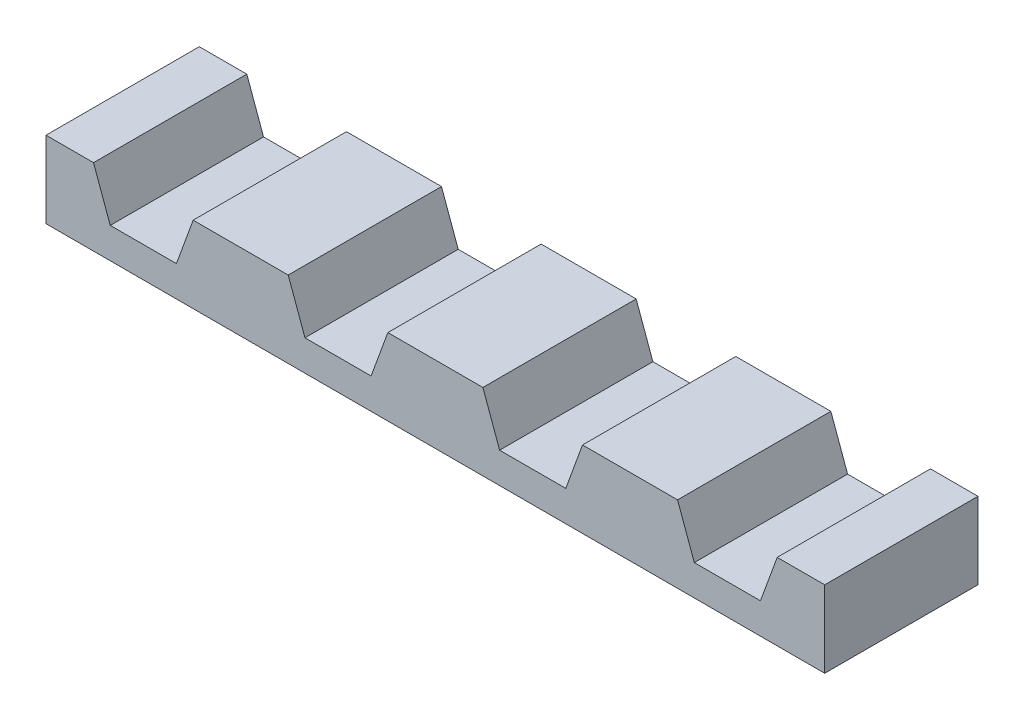
ISO-10303-21;
HEADER;
FILE_DESCRIPTION(('STEP AP214'),'2;1');
FILE_NAME('part.step','',(''),(''),'','','');
FILE_SCHEMA(('AUTOMOTIVE_DESIGN { 1 0 10303 214 1 1 1 1 }'));
ENDSEC;
DATA;
#1=APPLICATION_CONTEXT('core data for automotive mechanical design processes');
#2=APPLICATION_PROTOCOL_DEFINITION('international standard','automotive_design',2000,#1);
#3=PRODUCT_CONTEXT('',#1,'mechanical');
#4=PRODUCT('Part','Part','',(#3));
#5=PRODUCT_RELATED_PRODUCT_CATEGORY('part','',(#4));
#6=PRODUCT_DEFINITION_FORMATION('','',#4);
#7=PRODUCT_DEFINITION_CONTEXT('part definition',#1,'design');
#8=PRODUCT_DEFINITION('design','',#6,#7);
#9=PRODUCT_DEFINITION_SHAPE('','',#8);
#10=(LENGTH_UNIT() NAMED_UNIT(*) SI_UNIT(.MILLI.,.METRE.));
#11=(NAMED_UNIT(*) PLANE_ANGLE_UNIT() SI_UNIT($,.RADIAN.));
#12=(NAMED_UNIT(*) SI_UNIT($,.STERADIAN.) SOLID_ANGLE_UNIT());
#13=UNCERTAINTY_MEASURE_WITH_UNIT(LENGTH_MEASURE(1.E-05),#10,'distance_accuracy_value','');
#14=(GEOMETRIC_REPRESENTATION_CONTEXT(3) GLOBAL_UNCERTAINTY_ASSIGNED_CONTEXT((#13)) GLOBAL_UNIT_ASSIGNED_CONTEXT((#10,
#11,#12)) REPRESENTATION_CONTEXT('',''));
#15=CARTESIAN_POINT('',(0.,0.,0.));
#16=DIRECTION('',(0.,0.,1.));
#17=DIRECTION('',(1.,0.,0.));
#18=AXIS2_PLACEMENT_3D('',#15,#16,#17);
#19=CARTESIAN_POINT('',(0.,5.,10.));
#20=DIRECTION('',(0.,-1.,0.));
#21=DIRECTION('',(0.,0.,-1.));
#22=AXIS2_PLACEMENT_3D('',#19,#20,#21);
#23=PLANE('',#22);
#24=DIRECTION('',(-1.,0.,0.));
#25=VECTOR('',#24,1.);
#26=CARTESIAN_POINT('',(0.,5.,0.));
#27=LINE('',#26,#25);
#28=CARTESIAN_POINT('',(41.2,5.,0.));
#29=VERTEX_POINT('',#28);
#30=CARTESIAN_POINT('',(35.,5.,0.));
#31=VERTEX_POINT('',#30);
#32=EDGE_CURVE('E297',#29,#31,#27,.T.);
#33=ORIENTED_EDGE('',*,*,#32,.T.);
#34=DIRECTION('',(0.,0.,1.));
#35=VECTOR('',#34,1.);
#36=CARTESIAN_POINT('',(35.,5.,10.));
#37=LINE('',#36,#35);
#38=CARTESIAN_POINT('',(35.,5.,10.));
#39=VERTEX_POINT('',#38);
#40=EDGE_CURVE('E182',#31,#39,#37,.T.);
#41=ORIENTED_EDGE('',*,*,#40,.T.);
#42=DIRECTION('',(-1.,0.,0.));
#43=VECTOR('',#42,1.);
#44=CARTESIAN_POINT('',(0.,5.,10.));
#45=LINE('',#44,#43);
#46=CARTESIAN_POINT('',(41.2,5.,10.));
#47=VERTEX_POINT('',#46);
#48=EDGE_CURVE('E286',#47,#39,#45,.T.);
#49=ORIENTED_EDGE('',*,*,#48,.F.);
#50=DIRECTION('',(0.,0.,-1.));
#51=VECTOR('',#50,1.);
#52=CARTESIAN_POINT('',(41.2,5.,10.));
#53=LINE('',#52,#51);
#54=EDGE_CURVE('E175',#47,#29,#53,.T.);
#55=ORIENTED_EDGE('',*,*,#54,.T.);
#56=EDGE_LOOP('',(#33,#41,#49,#55));
#57=FACE_BOUND('',#56,.T.);
#58=ADVANCED_FACE('F32',(#57),#23,.F.);
#59=CARTESIAN_POINT('',(50.8,5.,0.));
#60=VERTEX_POINT('',#59);
#61=CARTESIAN_POINT('',(47.7,5.,0.));
#62=VERTEX_POINT('',#61);
#63=EDGE_CURVE('E277',#60,#62,#27,.T.);
#64=ORIENTED_EDGE('',*,*,#63,.T.);
#65=DIRECTION('',(0.,0.,1.));
#66=VECTOR('',#65,1.);
#67=CARTESIAN_POINT('',(47.7,5.,10.));
#68=LINE('',#67,#66);
#69=CARTESIAN_POINT('',(47.7,5.,10.));
#70=VERTEX_POINT('',#69);
#71=EDGE_CURVE('E215',#62,#70,#68,.T.);
#72=ORIENTED_EDGE('',*,*,#71,.T.);
#73=CARTESIAN_POINT('',(50.8,5.,10.));
#74=VERTEX_POINT('',#73);
#75=EDGE_CURVE('E282',#74,#70,#45,.T.);
#76=ORIENTED_EDGE('',*,*,#75,.F.);
#77=DIRECTION('',(0.,0.,-1.));
#78=VECTOR('',#77,1.);
#79=CARTESIAN_POINT('',(50.8,5.,10.));
#80=LINE('',#79,#78);
#81=EDGE_CURVE('E301',#74,#60,#80,.T.);
#82=ORIENTED_EDGE('',*,*,#81,.T.);
#83=EDGE_LOOP('',(#64,#72,#76,#82));
#84=FACE_BOUND('',#83,.T.);
#85=ADVANCED_FACE('F356',(#84),#23,.F.);
#86=CARTESIAN_POINT('',(28.5,5.,10.));
#87=VERTEX_POINT('',#86);
#88=CARTESIAN_POINT('',(22.3,5.,10.));
#89=VERTEX_POINT('',#88);
#90=EDGE_CURVE('E287',#87,#89,#45,.T.);
#91=ORIENTED_EDGE('',*,*,#90,.F.);
#92=DIRECTION('',(0.,0.,-1.));
#93=VECTOR('',#92,1.);
#94=CARTESIAN_POINT('',(28.5,5.,10.));
#95=LINE('',#94,#93);
#96=CARTESIAN_POINT('',(28.5,5.,0.));
#97=VERTEX_POINT('',#96);
#98=EDGE_CURVE('E218',#87,#97,#95,.T.);
#99=ORIENTED_EDGE('',*,*,#98,.T.);
#100=CARTESIAN_POINT('',(22.3,5.,0.));
#101=VERTEX_POINT('',#100);
#102=EDGE_CURVE('E298',#97,#101,#27,.T.);
#103=ORIENTED_EDGE('',*,*,#102,.T.);
#104=DIRECTION('',(0.,0.,1.));
#105=VECTOR('',#104,1.);
#106=CARTESIAN_POINT('',(22.3,5.,10.));
#107=LINE('',#106,#105);
#108=EDGE_CURVE('E244',#101,#89,#107,.T.);
#109=ORIENTED_EDGE('',*,*,#108,.T.);
#110=EDGE_LOOP('',(#91,#99,#103,#109));
#111=FACE_BOUND('',#110,.T.);
#112=ADVANCED_FACE('F372',(#111),#23,.F.);
#113=CARTESIAN_POINT('',(15.8,5.,10.));
#114=VERTEX_POINT('',#113);
#115=CARTESIAN_POINT('',(9.6,5.,10.));
#116=VERTEX_POINT('',#115);
#117=EDGE_CURVE('E344',#114,#116,#45,.T.);
#118=ORIENTED_EDGE('',*,*,#117,.F.);
#119=DIRECTION('',(0.,0.,-1.));
#120=VECTOR('',#119,1.);
#121=CARTESIAN_POINT('',(15.8,5.,10.));
#122=LINE('',#121,#120);
#123=CARTESIAN_POINT('',(15.8,5.,0.));
#124=VERTEX_POINT('',#123);
#125=EDGE_CURVE('E239',#114,#124,#122,.T.);
#126=ORIENTED_EDGE('',*,*,#125,.T.);
#127=CARTESIAN_POINT('',(9.6,5.,0.));
#128=VERTEX_POINT('',#127);
#129=EDGE_CURVE('E320',#124,#128,#27,.T.);
#130=ORIENTED_EDGE('',*,*,#129,.T.);
#131=DIRECTION('',(0.,0.,1.));
#132=VECTOR('',#131,1.);
#133=CARTESIAN_POINT('',(9.6,5.,10.));
#134=LINE('',#133,#132);
#135=EDGE_CURVE('E269',#128,#116,#134,.T.);
#136=ORIENTED_EDGE('',*,*,#135,.T.);
#137=EDGE_LOOP('',(#118,#126,#130,#136));
#138=FACE_BOUND('',#137,.T.);
#139=ADVANCED_FACE('F367',(#138),#23,.F.);
#140=CARTESIAN_POINT('',(0.,0.,10.));
#141=DIRECTION('',(1.,0.,0.));
#142=DIRECTION('',(0.,0.,-1.));
#143=AXIS2_PLACEMENT_3D('',#140,#141,#142);
#144=PLANE('',#143);
#145=DIRECTION('',(0.,-1.,0.));
#146=VECTOR('',#145,1.);
#147=CARTESIAN_POINT('',(0.,0.,0.));
#148=LINE('',#147,#146);
#149=CARTESIAN_POINT('',(0.,5.,0.));
#150=VERTEX_POINT('',#149);
#151=CARTESIAN_POINT('',(0.,0.,0.));
#152=VERTEX_POINT('',#151);
#153=EDGE_CURVE('E272',#150,#152,#148,.T.);
#154=ORIENTED_EDGE('',*,*,#153,.T.);
#155=DIRECTION('',(0.,0.,-1.));
#156=VECTOR('',#155,1.);
#157=CARTESIAN_POINT('',(0.,0.,10.));
#158=LINE('',#157,#156);
#159=CARTESIAN_POINT('',(0.,0.,10.));
#160=VERTEX_POINT('',#159);
#161=EDGE_CURVE('E307',#160,#152,#158,.T.);
#162=ORIENTED_EDGE('',*,*,#161,.F.);
#163=DIRECTION('',(0.,-1.,0.));
#164=VECTOR('',#163,1.);
#165=CARTESIAN_POINT('',(0.,0.,10.));
#166=LINE('',#165,#164);
#167=CARTESIAN_POINT('',(0.,5.,10.));
#168=VERTEX_POINT('',#167);
#169=EDGE_CURVE('E273',#168,#160,#166,.T.);
#170=ORIENTED_EDGE('',*,*,#169,.F.);
#171=DIRECTION('',(0.,0.,-1.));
#172=VECTOR('',#171,1.);
#173=CARTESIAN_POINT('',(0.,5.,10.));
#174=LINE('',#173,#172);
#175=EDGE_CURVE('E285',#168,#150,#174,.T.);
#176=ORIENTED_EDGE('',*,*,#175,.T.);
#177=EDGE_LOOP('',(#154,#162,#170,#176));
#178=FACE_BOUND('',#177,.T.);
#179=ADVANCED_FACE('F34',(#178),#144,.F.);
#180=CARTESIAN_POINT('',(0.,0.,10.));
#181=DIRECTION('',(0.,1.,0.));
#182=DIRECTION('',(0.,0.,1.));
#183=AXIS2_PLACEMENT_3D('',#180,#181,#182);
#184=PLANE('',#183);
#185=DIRECTION('',(1.,0.,0.));
#186=VECTOR('',#185,1.);
#187=CARTESIAN_POINT('',(0.,0.,0.));
#188=LINE('',#187,#186);
#189=CARTESIAN_POINT('',(50.8,0.,0.));
#190=VERTEX_POINT('',#189);
#191=EDGE_CURVE('E290',#152,#190,#188,.T.);
#192=ORIENTED_EDGE('',*,*,#191,.T.);
#193=DIRECTION('',(0.,0.,-1.));
#194=VECTOR('',#193,1.);
#195=CARTESIAN_POINT('',(50.8,0.,10.));
#196=LINE('',#195,#194);
#197=CARTESIAN_POINT('',(50.8,0.,10.));
#198=VERTEX_POINT('',#197);
#199=EDGE_CURVE('E304',#198,#190,#196,.T.);
#200=ORIENTED_EDGE('',*,*,#199,.F.);
#201=DIRECTION('',(1.,0.,0.));
#202=VECTOR('',#201,1.);
#203=CARTESIAN_POINT('',(0.,0.,10.));
#204=LINE('',#203,#202);
#205=EDGE_CURVE('E276',#160,#198,#204,.T.);
#206=ORIENTED_EDGE('',*,*,#205,.F.);
#207=ORIENTED_EDGE('',*,*,#161,.T.);
#208=EDGE_LOOP('',(#192,#200,#206,#207));
#209=FACE_BOUND('',#208,.T.);
#210=ADVANCED_FACE('F338',(#209),#184,.F.);
#211=CARTESIAN_POINT('',(50.8,0.,10.));
#212=DIRECTION('',(-1.,0.,0.));
#213=DIRECTION('',(0.,0.,1.));
#214=AXIS2_PLACEMENT_3D('',#211,#212,#213);
#215=PLANE('',#214);
#216=DIRECTION('',(0.,1.,0.));
#217=VECTOR('',#216,1.);
#218=CARTESIAN_POINT('',(50.8,0.,0.));
#219=LINE('',#218,#217);
#220=EDGE_CURVE('E292',#190,#60,#219,.T.);
#221=ORIENTED_EDGE('',*,*,#220,.T.);
#222=ORIENTED_EDGE('',*,*,#81,.F.);
#223=DIRECTION('',(0.,1.,0.));
#224=VECTOR('',#223,1.);
#225=CARTESIAN_POINT('',(50.8,0.,10.));
#226=LINE('',#225,#224);
#227=EDGE_CURVE('E279',#198,#74,#226,.T.);
#228=ORIENTED_EDGE('',*,*,#227,.F.);
#229=ORIENTED_EDGE('',*,*,#199,.T.);
#230=EDGE_LOOP('',(#221,#222,#228,#229));
#231=FACE_BOUND('',#230,.T.);
#232=ADVANCED_FACE('F359',(#231),#215,.F.);
#233=CARTESIAN_POINT('',(3.1,5.,10.));
#234=VERTEX_POINT('',#233);
#235=EDGE_CURVE('E281',#234,#168,#45,.T.);
#236=ORIENTED_EDGE('',*,*,#235,.F.);
#237=DIRECTION('',(0.,0.,-1.));
#238=VECTOR('',#237,1.);
#239=CARTESIAN_POINT('',(3.1,5.,10.));
#240=LINE('',#239,#238);
#241=CARTESIAN_POINT('',(3.1,5.,0.));
#242=VERTEX_POINT('',#241);
#243=EDGE_CURVE('E264',#234,#242,#240,.T.);
#244=ORIENTED_EDGE('',*,*,#243,.T.);
#245=EDGE_CURVE('E294',#242,#150,#27,.T.);
#246=ORIENTED_EDGE('',*,*,#245,.T.);
#247=ORIENTED_EDGE('',*,*,#175,.F.);
#248=EDGE_LOOP('',(#236,#244,#246,#247));
#249=FACE_BOUND('',#248,.T.);
#250=ADVANCED_FACE('F328',(#249),#23,.F.);
#251=CARTESIAN_POINT('',(0.,0.,10.));
#252=DIRECTION('',(0.,0.,-1.));
#253=DIRECTION('',(-1.,0.,0.));
#254=AXIS2_PLACEMENT_3D('',#251,#252,#253);
#255=PLANE('',#254);
#256=ORIENTED_EDGE('',*,*,#48,.T.);
#257=DIRECTION('',(0.342020143325666,0.939692620785909,0.));
#258=VECTOR('',#257,1.);
#259=CARTESIAN_POINT('',(33.9080892972014,2.,10.));
#260=LINE('',#259,#258);
#261=CARTESIAN_POINT('',(33.9080892972014,2.,10.));
#262=VERTEX_POINT('',#261);
#263=EDGE_CURVE('E190',#262,#39,#260,.T.);
#264=ORIENTED_EDGE('',*,*,#263,.F.);
#265=DIRECTION('',(1.,0.,0.));
#266=VECTOR('',#265,1.);
#267=CARTESIAN_POINT('',(29.5919107027986,2.,10.));
#268=LINE('',#267,#266);
#269=CARTESIAN_POINT('',(29.5919107027986,2.,10.));
#270=VERTEX_POINT('',#269);
#271=EDGE_CURVE('E172',#270,#262,#268,.T.);
#272=ORIENTED_EDGE('',*,*,#271,.F.);
#273=DIRECTION('',(0.342020143325666,-0.939692620785909,0.));
#274=VECTOR('',#273,1.);
#275=CARTESIAN_POINT('',(27.4080892972014,8.00000000000001,10.));
#276=LINE('',#275,#274);
#277=EDGE_CURVE('E194',#87,#270,#276,.T.);
#278=ORIENTED_EDGE('',*,*,#277,.F.);
#279=ORIENTED_EDGE('',*,*,#90,.T.);
#280=DIRECTION('',(0.342020143325666,0.939692620785909,0.));
#281=VECTOR('',#280,1.);
#282=CARTESIAN_POINT('',(21.2080892972014,2.,10.));
#283=LINE('',#282,#281);
#284=CARTESIAN_POINT('',(21.2080892972014,2.,10.));
#285=VERTEX_POINT('',#284);
#286=EDGE_CURVE('E227',#285,#89,#283,.T.);
#287=ORIENTED_EDGE('',*,*,#286,.F.);
#288=DIRECTION('',(1.,0.,0.));
#289=VECTOR('',#288,1.);
#290=CARTESIAN_POINT('',(16.8919107027986,2.,10.));
#291=LINE('',#290,#289);
#292=CARTESIAN_POINT('',(16.8919107027986,2.,10.));
#293=VERTEX_POINT('',#292);
#294=EDGE_CURVE('E232',#293,#285,#291,.T.);
#295=ORIENTED_EDGE('',*,*,#294,.F.);
#296=DIRECTION('',(0.342020143325666,-0.939692620785909,0.));
#297=VECTOR('',#296,1.);
#298=CARTESIAN_POINT('',(14.7080892972014,8.00000000000001,10.));
#299=LINE('',#298,#297);
#300=EDGE_CURVE('E222',#114,#293,#299,.T.);
#301=ORIENTED_EDGE('',*,*,#300,.F.);
#302=ORIENTED_EDGE('',*,*,#117,.T.);
#303=DIRECTION('',(0.342020143325666,0.939692620785909,0.));
#304=VECTOR('',#303,1.);
#305=CARTESIAN_POINT('',(8.5080892972014,2.,10.));
#306=LINE('',#305,#304);
#307=CARTESIAN_POINT('',(8.5080892972014,2.,10.));
#308=VERTEX_POINT('',#307);
#309=EDGE_CURVE('E252',#308,#116,#306,.T.);
#310=ORIENTED_EDGE('',*,*,#309,.F.);
#311=DIRECTION('',(1.,0.,0.));
#312=VECTOR('',#311,1.);
#313=CARTESIAN_POINT('',(4.1919107027986,2.,10.));
#314=LINE('',#313,#312);
#315=CARTESIAN_POINT('',(4.1919107027986,2.,10.));
#316=VERTEX_POINT('',#315);
#317=EDGE_CURVE('E257',#316,#308,#314,.T.);
#318=ORIENTED_EDGE('',*,*,#317,.F.);
#319=DIRECTION('',(0.342020143325666,-0.939692620785909,0.));
#320=VECTOR('',#319,1.);
#321=CARTESIAN_POINT('',(2.0080892972014,8.00000000000001,10.));
#322=LINE('',#321,#320);
#323=EDGE_CURVE('E247',#234,#316,#322,.T.);
#324=ORIENTED_EDGE('',*,*,#323,.F.);
#325=ORIENTED_EDGE('',*,*,#235,.T.);
#326=ORIENTED_EDGE('',*,*,#169,.T.);
#327=ORIENTED_EDGE('',*,*,#205,.T.);
#328=ORIENTED_EDGE('',*,*,#227,.T.);
#329=ORIENTED_EDGE('',*,*,#75,.T.);
#330=DIRECTION('',(0.342020143325666,0.939692620785909,0.));
#331=VECTOR('',#330,1.);
#332=CARTESIAN_POINT('',(46.6080892972014,2.,10.));
#333=LINE('',#332,#331);
#334=CARTESIAN_POINT('',(46.6080892972014,2.,10.));
#335=VERTEX_POINT('',#334);
#336=EDGE_CURVE('E201',#335,#70,#333,.T.);
#337=ORIENTED_EDGE('',*,*,#336,.F.);
#338=DIRECTION('',(1.,0.,0.));
#339=VECTOR('',#338,1.);
#340=CARTESIAN_POINT('',(42.2919107027986,2.,10.));
#341=LINE('',#340,#339);
#342=CARTESIAN_POINT('',(42.2919107027986,2.,10.));
#343=VERTEX_POINT('',#342);
#344=EDGE_CURVE('E207',#343,#335,#341,.T.);
#345=ORIENTED_EDGE('',*,*,#344,.F.);
#346=DIRECTION('',(0.342020143325666,-0.939692620785909,0.));
#347=VECTOR('',#346,1.);
#348=CARTESIAN_POINT('',(40.1080892972014,8.00000000000001,10.));
#349=LINE('',#348,#347);
#350=EDGE_CURVE('E205',#47,#343,#349,.T.);
#351=ORIENTED_EDGE('',*,*,#350,.F.);
#352=EDGE_LOOP('',(#256,#264,#272,#278,#279,#287,#295,#301,#302,#310,#318,#324,#325,#326,#327,
#328,#329,#337,#345,#351));
#353=FACE_BOUND('',#352,.T.);
#354=ADVANCED_FACE('F341',(#353),#255,.F.);
#355=CARTESIAN_POINT('',(0.,0.,0.));
#356=DIRECTION('',(0.,0.,-1.));
#357=DIRECTION('',(-1.,0.,0.));
#358=AXIS2_PLACEMENT_3D('',#355,#356,#357);
#359=PLANE('',#358);
#360=DIRECTION('',(0.342020143325666,0.939692620785909,0.));
#361=VECTOR('',#360,1.);
#362=CARTESIAN_POINT('',(33.9080892972014,2.,0.));
#363=LINE('',#362,#361);
#364=CARTESIAN_POINT('',(33.9080892972014,2.,0.));
#365=VERTEX_POINT('',#364);
#366=EDGE_CURVE('E179',#365,#31,#363,.T.);
#367=ORIENTED_EDGE('',*,*,#366,.T.);
#368=ORIENTED_EDGE('',*,*,#32,.F.);
#369=DIRECTION('',(-0.342020143325666,0.939692620785909,0.));
#370=VECTOR('',#369,1.);
#371=CARTESIAN_POINT('',(37.9874845524674,13.8263136517452,0.));
#372=LINE('',#371,#370);
#373=CARTESIAN_POINT('',(42.2919107027986,2.,0.));
#374=VERTEX_POINT('',#373);
#375=EDGE_CURVE('E40',#374,#29,#372,.T.);
#376=ORIENTED_EDGE('',*,*,#375,.F.);
#377=DIRECTION('',(1.,0.,0.));
#378=VECTOR('',#377,1.);
#379=CARTESIAN_POINT('',(42.2919107027986,2.,0.));
#380=LINE('',#379,#378);
#381=CARTESIAN_POINT('',(46.6080892972014,2.,0.));
#382=VERTEX_POINT('',#381);
#383=EDGE_CURVE('E55',#374,#382,#380,.T.);
#384=ORIENTED_EDGE('',*,*,#383,.T.);
#385=DIRECTION('',(0.342020143325666,0.939692620785909,0.));
#386=VECTOR('',#385,1.);
#387=CARTESIAN_POINT('',(46.6080892972014,2.,0.));
#388=LINE('',#387,#386);
#389=EDGE_CURVE('E200',#382,#62,#388,.T.);
#390=ORIENTED_EDGE('',*,*,#389,.T.);
#391=ORIENTED_EDGE('',*,*,#63,.F.);
#392=ORIENTED_EDGE('',*,*,#220,.F.);
#393=ORIENTED_EDGE('',*,*,#191,.F.);
#394=ORIENTED_EDGE('',*,*,#153,.F.);
#395=ORIENTED_EDGE('',*,*,#245,.F.);
#396=DIRECTION('',(-0.342020143325666,0.939692620785909,0.));
#397=VECTOR('',#396,1.);
#398=CARTESIAN_POINT('',(4.34433791105076,1.58120968721668,0.));
#399=LINE('',#398,#397);
#400=CARTESIAN_POINT('',(4.1919107027986,2.,0.));
#401=VERTEX_POINT('',#400);
#402=EDGE_CURVE('E310',#401,#242,#399,.T.);
#403=ORIENTED_EDGE('',*,*,#402,.F.);
#404=DIRECTION('',(1.,0.,0.));
#405=VECTOR('',#404,1.);
#406=CARTESIAN_POINT('',(4.1919107027986,2.,0.));
#407=LINE('',#406,#405);
#408=CARTESIAN_POINT('',(8.5080892972014,2.,0.));
#409=VERTEX_POINT('',#408);
#410=EDGE_CURVE('E248',#401,#409,#407,.T.);
#411=ORIENTED_EDGE('',*,*,#410,.T.);
#412=DIRECTION('',(0.342020143325666,0.939692620785909,0.));
#413=VECTOR('',#412,1.);
#414=CARTESIAN_POINT('',(8.5080892972014,2.,0.));
#415=LINE('',#414,#413);
#416=EDGE_CURVE('E251',#409,#128,#415,.T.);
#417=ORIENTED_EDGE('',*,*,#416,.T.);
#418=ORIENTED_EDGE('',*,*,#129,.F.);
#419=DIRECTION('',(-0.342020143325666,0.939692620785909,0.));
#420=VECTOR('',#419,1.);
#421=CARTESIAN_POINT('',(15.5587201248563,5.66291100872618,0.));
#422=LINE('',#421,#420);
#423=CARTESIAN_POINT('',(16.8919107027986,2.,0.));
#424=VERTEX_POINT('',#423);
#425=EDGE_CURVE('E312',#424,#124,#422,.T.);
#426=ORIENTED_EDGE('',*,*,#425,.F.);
#427=DIRECTION('',(1.,0.,0.));
#428=VECTOR('',#427,1.);
#429=CARTESIAN_POINT('',(16.8919107027986,2.,0.));
#430=LINE('',#429,#428);
#431=CARTESIAN_POINT('',(21.2080892972014,2.,0.));
#432=VERTEX_POINT('',#431);
#433=EDGE_CURVE('E223',#424,#432,#430,.T.);
#434=ORIENTED_EDGE('',*,*,#433,.T.);
#435=DIRECTION('',(0.342020143325666,0.939692620785909,0.));
#436=VECTOR('',#435,1.);
#437=CARTESIAN_POINT('',(21.2080892972014,2.,0.));
#438=LINE('',#437,#436);
#439=EDGE_CURVE('E226',#432,#101,#438,.T.);
#440=ORIENTED_EDGE('',*,*,#439,.T.);
#441=ORIENTED_EDGE('',*,*,#102,.F.);
#442=DIRECTION('',(-0.342020143325666,0.939692620785909,0.));
#443=VECTOR('',#442,1.);
#444=CARTESIAN_POINT('',(26.7731023386618,9.74461233023568,0.));
#445=LINE('',#444,#443);
#446=CARTESIAN_POINT('',(29.5919107027986,2.,0.));
#447=VERTEX_POINT('',#446);
#448=EDGE_CURVE('E11',#447,#97,#445,.T.);
#449=ORIENTED_EDGE('',*,*,#448,.F.);
#450=DIRECTION('',(1.,0.,0.));
#451=VECTOR('',#450,1.);
#452=CARTESIAN_POINT('',(29.5919107027986,2.,0.));
#453=LINE('',#452,#451);
#454=EDGE_CURVE('E47',#447,#365,#453,.T.);
#455=ORIENTED_EDGE('',*,*,#454,.T.);
#456=EDGE_LOOP('',(#367,#368,#376,#384,#390,#391,#392,#393,#394,#395,#403,#411,#417,#418,#426,
#434,#440,#441,#449,#455));
#457=FACE_BOUND('',#456,.T.);
#458=ADVANCED_FACE('F188',(#457),#359,.T.);
#459=CARTESIAN_POINT('',(8.5080892972014,2.,0.));
#460=DIRECTION('',(0.939692620785909,-0.342020143325666,0.));
#461=DIRECTION('',(0.342020143325666,0.93969262078591,0.));
#462=AXIS2_PLACEMENT_3D('',#459,#460,#461);
#463=PLANE('',#462);
#464=ORIENTED_EDGE('',*,*,#416,.F.);
#465=DIRECTION('',(0.,0.,1.));
#466=VECTOR('',#465,1.);
#467=CARTESIAN_POINT('',(8.5080892972014,2.,0.));
#468=LINE('',#467,#466);
#469=EDGE_CURVE('E262',#409,#308,#468,.T.);
#470=ORIENTED_EDGE('',*,*,#469,.T.);
#471=ORIENTED_EDGE('',*,*,#309,.T.);
#472=ORIENTED_EDGE('',*,*,#135,.F.);
#473=EDGE_LOOP('',(#464,#470,#471,#472));
#474=FACE_BOUND('',#473,.T.);
#475=ADVANCED_FACE('F376',(#474),#463,.F.);
#476=CARTESIAN_POINT('',(2.0080892972014,8.00000000000001,0.));
#477=DIRECTION('',(-0.939692620785909,-0.342020143325666,0.));
#478=DIRECTION('',(0.342020143325666,-0.939692620785909,0.));
#479=AXIS2_PLACEMENT_3D('',#476,#477,#478);
#480=PLANE('',#479);
#481=ORIENTED_EDGE('',*,*,#323,.T.);
#482=DIRECTION('',(0.,0.,1.));
#483=VECTOR('',#482,1.);
#484=CARTESIAN_POINT('',(4.1919107027986,2.,0.));
#485=LINE('',#484,#483);
#486=EDGE_CURVE('E255',#401,#316,#485,.T.);
#487=ORIENTED_EDGE('',*,*,#486,.F.);
#488=ORIENTED_EDGE('',*,*,#402,.T.);
#489=ORIENTED_EDGE('',*,*,#243,.F.);
#490=EDGE_LOOP('',(#481,#487,#488,#489));
#491=FACE_BOUND('',#490,.T.);
#492=ADVANCED_FACE('F379',(#491),#480,.F.);
#493=CARTESIAN_POINT('',(4.1919107027986,2.,0.));
#494=DIRECTION('',(0.,-1.,0.));
#495=DIRECTION('',(1.,0.,0.));
#496=AXIS2_PLACEMENT_3D('',#493,#494,#495);
#497=PLANE('',#496);
#498=ORIENTED_EDGE('',*,*,#317,.T.);
#499=ORIENTED_EDGE('',*,*,#469,.F.);
#500=ORIENTED_EDGE('',*,*,#410,.F.);
#501=ORIENTED_EDGE('',*,*,#486,.T.);
#502=EDGE_LOOP('',(#498,#499,#500,#501));
#503=FACE_BOUND('',#502,.T.);
#504=ADVANCED_FACE('F382',(#503),#497,.F.);
#505=CARTESIAN_POINT('',(21.2080892972014,2.,0.));
#506=DIRECTION('',(0.939692620785909,-0.342020143325666,0.));
#507=DIRECTION('',(0.342020143325666,0.93969262078591,0.));
#508=AXIS2_PLACEMENT_3D('',#505,#506,#507);
#509=PLANE('',#508);
#510=ORIENTED_EDGE('',*,*,#439,.F.);
#511=DIRECTION('',(0.,0.,1.));
#512=VECTOR('',#511,1.);
#513=CARTESIAN_POINT('',(21.2080892972014,2.,0.));
#514=LINE('',#513,#512);
#515=EDGE_CURVE('E237',#432,#285,#514,.T.);
#516=ORIENTED_EDGE('',*,*,#515,.T.);
#517=ORIENTED_EDGE('',*,*,#286,.T.);
#518=ORIENTED_EDGE('',*,*,#108,.F.);
#519=EDGE_LOOP('',(#510,#516,#517,#518));
#520=FACE_BOUND('',#519,.T.);
#521=ADVANCED_FACE('F386',(#520),#509,.F.);
#522=CARTESIAN_POINT('',(14.7080892972014,8.00000000000001,0.));
#523=DIRECTION('',(-0.939692620785909,-0.342020143325666,0.));
#524=DIRECTION('',(0.342020143325666,-0.939692620785909,0.));
#525=AXIS2_PLACEMENT_3D('',#522,#523,#524);
#526=PLANE('',#525);
#527=ORIENTED_EDGE('',*,*,#300,.T.);
#528=DIRECTION('',(0.,0.,1.));
#529=VECTOR('',#528,1.);
#530=CARTESIAN_POINT('',(16.8919107027986,2.,0.));
#531=LINE('',#530,#529);
#532=EDGE_CURVE('E230',#424,#293,#531,.T.);
#533=ORIENTED_EDGE('',*,*,#532,.F.);
#534=ORIENTED_EDGE('',*,*,#425,.T.);
#535=ORIENTED_EDGE('',*,*,#125,.F.);
#536=EDGE_LOOP('',(#527,#533,#534,#535));
#537=FACE_BOUND('',#536,.T.);
#538=ADVANCED_FACE('F391',(#537),#526,.F.);
#539=CARTESIAN_POINT('',(16.8919107027986,2.,0.));
#540=DIRECTION('',(0.,-1.,0.));
#541=DIRECTION('',(1.,0.,0.));
#542=AXIS2_PLACEMENT_3D('',#539,#540,#541);
#543=PLANE('',#542);
#544=ORIENTED_EDGE('',*,*,#294,.T.);
#545=ORIENTED_EDGE('',*,*,#515,.F.);
#546=ORIENTED_EDGE('',*,*,#433,.F.);
#547=ORIENTED_EDGE('',*,*,#532,.T.);
#548=EDGE_LOOP('',(#544,#545,#546,#547));
#549=FACE_BOUND('',#548,.T.);
#550=ADVANCED_FACE('F394',(#549),#543,.F.);
#551=CARTESIAN_POINT('',(46.6080892972014,2.,0.));
#552=DIRECTION('',(0.939692620785909,-0.342020143325666,0.));
#553=DIRECTION('',(0.342020143325666,0.93969262078591,0.));
#554=AXIS2_PLACEMENT_3D('',#551,#552,#553);
#555=PLANE('',#554);
#556=ORIENTED_EDGE('',*,*,#389,.F.);
#557=DIRECTION('',(0.,0.,1.));
#558=VECTOR('',#557,1.);
#559=CARTESIAN_POINT('',(46.6080892972014,2.,0.));
#560=LINE('',#559,#558);
#561=EDGE_CURVE('E196',#382,#335,#560,.T.);
#562=ORIENTED_EDGE('',*,*,#561,.T.);
#563=ORIENTED_EDGE('',*,*,#336,.T.);
#564=ORIENTED_EDGE('',*,*,#71,.F.);
#565=EDGE_LOOP('',(#556,#562,#563,#564));
#566=FACE_BOUND('',#565,.T.);
#567=ADVANCED_FACE('F354',(#566),#555,.F.);
#568=CARTESIAN_POINT('',(40.1080892972014,8.00000000000001,0.));
#569=DIRECTION('',(-0.939692620785909,-0.342020143325666,0.));
#570=DIRECTION('',(0.342020143325666,-0.939692620785909,0.));
#571=AXIS2_PLACEMENT_3D('',#568,#569,#570);
#572=PLANE('',#571);
#573=ORIENTED_EDGE('',*,*,#350,.T.);
#574=DIRECTION('',(0.,0.,1.));
#575=VECTOR('',#574,1.);
#576=CARTESIAN_POINT('',(42.2919107027986,2.,0.));
#577=LINE('',#576,#575);
#578=EDGE_CURVE('E204',#374,#343,#577,.T.);
#579=ORIENTED_EDGE('',*,*,#578,.F.);
#580=ORIENTED_EDGE('',*,*,#375,.T.);
#581=ORIENTED_EDGE('',*,*,#54,.F.);
#582=EDGE_LOOP('',(#573,#579,#580,#581));
#583=FACE_BOUND('',#582,.T.);
#584=ADVANCED_FACE('F315',(#583),#572,.F.);
#585=CARTESIAN_POINT('',(42.2919107027986,2.,0.));
#586=DIRECTION('',(0.,-1.,0.));
#587=DIRECTION('',(1.,0.,0.));
#588=AXIS2_PLACEMENT_3D('',#585,#586,#587);
#589=PLANE('',#588);
#590=ORIENTED_EDGE('',*,*,#344,.T.);
#591=ORIENTED_EDGE('',*,*,#561,.F.);
#592=ORIENTED_EDGE('',*,*,#383,.F.);
#593=ORIENTED_EDGE('',*,*,#578,.T.);
#594=EDGE_LOOP('',(#590,#591,#592,#593));
#595=FACE_BOUND('',#594,.T.);
#596=ADVANCED_FACE('F350',(#595),#589,.F.);
#597=CARTESIAN_POINT('',(33.9080892972014,2.,0.));
#598=DIRECTION('',(0.939692620785909,-0.342020143325666,0.));
#599=DIRECTION('',(0.342020143325666,0.93969262078591,0.));
#600=AXIS2_PLACEMENT_3D('',#597,#598,#599);
#601=PLANE('',#600);
#602=ORIENTED_EDGE('',*,*,#366,.F.);
#603=DIRECTION('',(0.,0.,1.));
#604=VECTOR('',#603,1.);
#605=CARTESIAN_POINT('',(33.9080892972014,2.,0.));
#606=LINE('',#605,#604);
#607=EDGE_CURVE('E168',#365,#262,#606,.T.);
#608=ORIENTED_EDGE('',*,*,#607,.T.);
#609=ORIENTED_EDGE('',*,*,#263,.T.);
#610=ORIENTED_EDGE('',*,*,#40,.F.);
#611=EDGE_LOOP('',(#602,#608,#609,#610));
#612=FACE_BOUND('',#611,.T.);
#613=ADVANCED_FACE('F180',(#612),#601,.F.);
#614=CARTESIAN_POINT('',(27.4080892972014,8.00000000000001,0.));
#615=DIRECTION('',(-0.939692620785909,-0.342020143325666,0.));
#616=DIRECTION('',(0.342020143325666,-0.939692620785909,0.));
#617=AXIS2_PLACEMENT_3D('',#614,#615,#616);
#618=PLANE('',#617);
#619=ORIENTED_EDGE('',*,*,#277,.T.);
#620=DIRECTION('',(0.,0.,1.));
#621=VECTOR('',#620,1.);
#622=CARTESIAN_POINT('',(29.5919107027986,2.,0.));
#623=LINE('',#622,#621);
#624=EDGE_CURVE('E176',#447,#270,#623,.T.);
#625=ORIENTED_EDGE('',*,*,#624,.F.);
#626=ORIENTED_EDGE('',*,*,#448,.T.);
#627=ORIENTED_EDGE('',*,*,#98,.F.);
#628=EDGE_LOOP('',(#619,#625,#626,#627));
#629=FACE_BOUND('',#628,.T.);
#630=ADVANCED_FACE('F408',(#629),#618,.F.);
#631=CARTESIAN_POINT('',(29.5919107027986,2.,0.));
#632=DIRECTION('',(0.,-1.,0.));
#633=DIRECTION('',(1.,0.,0.));
#634=AXIS2_PLACEMENT_3D('',#631,#632,#633);
#635=PLANE('',#634);
#636=ORIENTED_EDGE('',*,*,#271,.T.);
#637=ORIENTED_EDGE('',*,*,#607,.F.);
#638=ORIENTED_EDGE('',*,*,#454,.F.);
#639=ORIENTED_EDGE('',*,*,#624,.T.);
#640=EDGE_LOOP('',(#636,#637,#638,#639));
#641=FACE_BOUND('',#640,.T.);
#642=ADVANCED_FACE('F170',(#641),#635,.F.);
#643=CLOSED_SHELL('',(#58,#85,#112,#139,#179,#210,#232,#250,#354,#458,#475,#492,#504,#521,#538,
#550,#567,#584,#596,#613,#630,#642));
#644=MANIFOLD_SOLID_BREP('B2',#643);
#645=ADVANCED_BREP_SHAPE_REPRESENTATION('',(#18,#644),#14);
#646=SHAPE_DEFINITION_REPRESENTATION(#9,#645);
ENDSEC;
END-ISO-10303-21;
